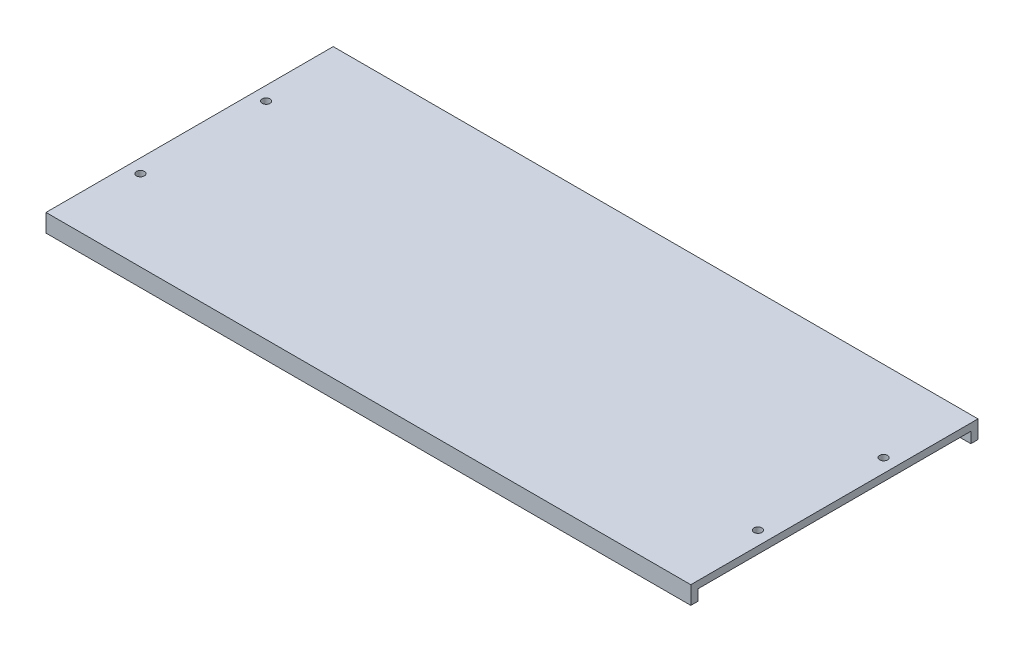
ISO-10303-21;
HEADER;
FILE_DESCRIPTION(('STEP AP214'),'2;1');
FILE_NAME('part.step','',(''),(''),'','','');
FILE_SCHEMA(('AUTOMOTIVE_DESIGN { 1 0 10303 214 1 1 1 1 }'));
ENDSEC;
DATA;
#1=APPLICATION_CONTEXT('core data for automotive mechanical design processes');
#2=APPLICATION_PROTOCOL_DEFINITION('international standard','automotive_design',2000,#1);
#3=PRODUCT_CONTEXT('',#1,'mechanical');
#4=PRODUCT('Part','Part','',(#3));
#5=PRODUCT_RELATED_PRODUCT_CATEGORY('part','',(#4));
#6=PRODUCT_DEFINITION_FORMATION('','',#4);
#7=PRODUCT_DEFINITION_CONTEXT('part definition',#1,'design');
#8=PRODUCT_DEFINITION('design','',#6,#7);
#9=PRODUCT_DEFINITION_SHAPE('','',#8);
#10=(LENGTH_UNIT() NAMED_UNIT(*) SI_UNIT(.MILLI.,.METRE.));
#11=(NAMED_UNIT(*) PLANE_ANGLE_UNIT() SI_UNIT($,.RADIAN.));
#12=(NAMED_UNIT(*) SI_UNIT($,.STERADIAN.) SOLID_ANGLE_UNIT());
#13=UNCERTAINTY_MEASURE_WITH_UNIT(LENGTH_MEASURE(1.E-05),#10,'distance_accuracy_value','');
#14=(GEOMETRIC_REPRESENTATION_CONTEXT(3) GLOBAL_UNCERTAINTY_ASSIGNED_CONTEXT((#13)) GLOBAL_UNIT_ASSIGNED_CONTEXT((#10,
#11,#12)) REPRESENTATION_CONTEXT('',''));
#15=CARTESIAN_POINT('',(0.,0.,0.));
#16=DIRECTION('',(0.,0.,1.));
#17=DIRECTION('',(1.,0.,0.));
#18=AXIS2_PLACEMENT_3D('',#15,#16,#17);
#19=CARTESIAN_POINT('',(0.,2.,0.));
#20=DIRECTION('',(0.,-1.,0.));
#21=DIRECTION('',(0.,0.,-1.));
#22=AXIS2_PLACEMENT_3D('',#19,#20,#21);
#23=PLANE('',#22);
#24=DIRECTION('',(0.,0.,-1.));
#25=VECTOR('',#24,1.);
#26=CARTESIAN_POINT('',(89.8,2.,38.));
#27=LINE('',#26,#25);
#28=CARTESIAN_POINT('',(89.7999999999999,2.,40.));
#29=VERTEX_POINT('',#28);
#30=CARTESIAN_POINT('',(89.8,2.,-40.));
#31=VERTEX_POINT('',#30);
#32=EDGE_CURVE('E44',#29,#31,#27,.T.);
#33=ORIENTED_EDGE('',*,*,#32,.T.);
#34=DIRECTION('',(-1.,0.,0.));
#35=VECTOR('',#34,1.);
#36=CARTESIAN_POINT('',(89.8,2.,-40.));
#37=LINE('',#36,#35);
#38=CARTESIAN_POINT('',(-89.8,2.,-40.));
#39=VERTEX_POINT('',#38);
#40=EDGE_CURVE('E133',#31,#39,#37,.T.);
#41=ORIENTED_EDGE('',*,*,#40,.T.);
#42=DIRECTION('',(0.,0.,1.));
#43=VECTOR('',#42,1.);
#44=CARTESIAN_POINT('',(-89.8,2.,38.));
#45=LINE('',#44,#43);
#46=CARTESIAN_POINT('',(-89.8,2.,40.));
#47=VERTEX_POINT('',#46);
#48=EDGE_CURVE('E11',#39,#47,#45,.T.);
#49=ORIENTED_EDGE('',*,*,#48,.T.);
#50=DIRECTION('',(1.,0.,0.));
#51=VECTOR('',#50,1.);
#52=CARTESIAN_POINT('',(89.7999999999999,2.,40.));
#53=LINE('',#52,#51);
#54=EDGE_CURVE('E126',#47,#29,#53,.T.);
#55=ORIENTED_EDGE('',*,*,#54,.T.);
#56=EDGE_LOOP('',(#33,#41,#49,#55));
#57=FACE_BOUND('',#56,.T.);
#58=CARTESIAN_POINT('',(-86.,2.,-17.5));
#59=DIRECTION('',(0.,1.,0.));
#60=DIRECTION('',(0.,0.,1.));
#61=AXIS2_PLACEMENT_3D('',#58,#59,#60);
#62=CIRCLE('',#61,1.10000000000001);
#63=CARTESIAN_POINT('',(-86.,2.,-16.4));
#64=VERTEX_POINT('',#63);
#65=EDGE_CURVE('E181',#64,#64,#62,.T.);
#66=ORIENTED_EDGE('',*,*,#65,.F.);
#67=EDGE_LOOP('',(#66));
#68=FACE_BOUND('',#67,.T.);
#69=CARTESIAN_POINT('',(-86.,2.,17.5));
#70=DIRECTION('',(0.,1.,0.));
#71=DIRECTION('',(0.,0.,-1.));
#72=AXIS2_PLACEMENT_3D('',#69,#70,#71);
#73=CIRCLE('',#72,1.10000000000001);
#74=CARTESIAN_POINT('',(-86.,2.,16.4));
#75=VERTEX_POINT('',#74);
#76=EDGE_CURVE('E175',#75,#75,#73,.T.);
#77=ORIENTED_EDGE('',*,*,#76,.F.);
#78=EDGE_LOOP('',(#77));
#79=FACE_BOUND('',#78,.T.);
#80=CARTESIAN_POINT('',(86.,2.,17.5));
#81=DIRECTION('',(0.,1.,0.));
#82=DIRECTION('',(0.,0.,1.));
#83=AXIS2_PLACEMENT_3D('',#80,#81,#82);
#84=CIRCLE('',#83,1.10000000000001);
#85=CARTESIAN_POINT('',(86.,2.,18.6));
#86=VERTEX_POINT('',#85);
#87=EDGE_CURVE('E169',#86,#86,#84,.T.);
#88=ORIENTED_EDGE('',*,*,#87,.F.);
#89=EDGE_LOOP('',(#88));
#90=FACE_BOUND('',#89,.T.);
#91=CARTESIAN_POINT('',(86.,2.,-17.5));
#92=DIRECTION('',(0.,1.,0.));
#93=DIRECTION('',(0.,0.,-1.));
#94=AXIS2_PLACEMENT_3D('',#91,#92,#93);
#95=CIRCLE('',#94,1.10000000000001);
#96=CARTESIAN_POINT('',(86.,2.,-18.6));
#97=VERTEX_POINT('',#96);
#98=EDGE_CURVE('E163',#97,#97,#95,.T.);
#99=ORIENTED_EDGE('',*,*,#98,.F.);
#100=EDGE_LOOP('',(#99));
#101=FACE_BOUND('',#100,.T.);
#102=ADVANCED_FACE('F35',(#57,#68,#79,#90,#101),#23,.F.);
#103=CARTESIAN_POINT('',(0.,0.,0.));
#104=DIRECTION('',(0.,-1.,0.));
#105=DIRECTION('',(0.,0.,-1.));
#106=AXIS2_PLACEMENT_3D('',#103,#104,#105);
#107=PLANE('',#106);
#108=CARTESIAN_POINT('',(86.,0.,17.5));
#109=DIRECTION('',(0.,1.,0.));
#110=DIRECTION('',(0.,0.,1.));
#111=AXIS2_PLACEMENT_3D('',#108,#109,#110);
#112=CIRCLE('',#111,1.10000000000001);
#113=CARTESIAN_POINT('',(86.,0.,18.6));
#114=VERTEX_POINT('',#113);
#115=EDGE_CURVE('E166',#114,#114,#112,.T.);
#116=ORIENTED_EDGE('',*,*,#115,.T.);
#117=EDGE_LOOP('',(#116));
#118=FACE_BOUND('',#117,.T.);
#119=CARTESIAN_POINT('',(-86.,0.,-17.5));
#120=DIRECTION('',(0.,1.,0.));
#121=DIRECTION('',(0.,0.,1.));
#122=AXIS2_PLACEMENT_3D('',#119,#120,#121);
#123=CIRCLE('',#122,1.10000000000001);
#124=CARTESIAN_POINT('',(-86.,0.,-16.4));
#125=VERTEX_POINT('',#124);
#126=EDGE_CURVE('E178',#125,#125,#123,.T.);
#127=ORIENTED_EDGE('',*,*,#126,.T.);
#128=EDGE_LOOP('',(#127));
#129=FACE_BOUND('',#128,.T.);
#130=DIRECTION('',(0.,0.,-1.));
#131=VECTOR('',#130,1.);
#132=CARTESIAN_POINT('',(89.8,0.,38.));
#133=LINE('',#132,#131);
#134=CARTESIAN_POINT('',(89.7999999999999,0.,38.));
#135=VERTEX_POINT('',#134);
#136=CARTESIAN_POINT('',(89.8,0.,-38.));
#137=VERTEX_POINT('',#136);
#138=EDGE_CURVE('E184',#135,#137,#133,.T.);
#139=ORIENTED_EDGE('',*,*,#138,.F.);
#140=DIRECTION('',(1.,0.,0.));
#141=VECTOR('',#140,1.);
#142=CARTESIAN_POINT('',(-89.8,0.,38.));
#143=LINE('',#142,#141);
#144=CARTESIAN_POINT('',(-89.8,0.,38.));
#145=VERTEX_POINT('',#144);
#146=EDGE_CURVE('E39',#145,#135,#143,.T.);
#147=ORIENTED_EDGE('',*,*,#146,.F.);
#148=DIRECTION('',(0.,0.,1.));
#149=VECTOR('',#148,1.);
#150=CARTESIAN_POINT('',(-89.8,0.,38.));
#151=LINE('',#150,#149);
#152=CARTESIAN_POINT('',(-89.8,0.,-38.));
#153=VERTEX_POINT('',#152);
#154=EDGE_CURVE('E52',#153,#145,#151,.T.);
#155=ORIENTED_EDGE('',*,*,#154,.F.);
#156=DIRECTION('',(-1.,0.,0.));
#157=VECTOR('',#156,1.);
#158=CARTESIAN_POINT('',(-89.8,0.,-38.));
#159=LINE('',#158,#157);
#160=EDGE_CURVE('E59',#137,#153,#159,.T.);
#161=ORIENTED_EDGE('',*,*,#160,.F.);
#162=EDGE_LOOP('',(#139,#147,#155,#161));
#163=FACE_BOUND('',#162,.T.);
#164=CARTESIAN_POINT('',(-86.,0.,17.5));
#165=DIRECTION('',(0.,1.,0.));
#166=DIRECTION('',(0.,0.,-1.));
#167=AXIS2_PLACEMENT_3D('',#164,#165,#166);
#168=CIRCLE('',#167,1.10000000000001);
#169=CARTESIAN_POINT('',(-86.,0.,16.4));
#170=VERTEX_POINT('',#169);
#171=EDGE_CURVE('E172',#170,#170,#168,.T.);
#172=ORIENTED_EDGE('',*,*,#171,.T.);
#173=EDGE_LOOP('',(#172));
#174=FACE_BOUND('',#173,.T.);
#175=CARTESIAN_POINT('',(86.,0.,-17.5));
#176=DIRECTION('',(0.,1.,0.));
#177=DIRECTION('',(0.,0.,-1.));
#178=AXIS2_PLACEMENT_3D('',#175,#176,#177);
#179=CIRCLE('',#178,1.10000000000001);
#180=CARTESIAN_POINT('',(86.,0.,-18.6));
#181=VERTEX_POINT('',#180);
#182=EDGE_CURVE('E156',#181,#181,#179,.T.);
#183=ORIENTED_EDGE('',*,*,#182,.T.);
#184=EDGE_LOOP('',(#183));
#185=FACE_BOUND('',#184,.T.);
#186=ADVANCED_FACE('F207',(#118,#129,#163,#174,#185),#107,.T.);
#187=CARTESIAN_POINT('',(89.8,2.,38.));
#188=DIRECTION('',(-1.,0.,0.));
#189=DIRECTION('',(0.,0.,1.));
#190=AXIS2_PLACEMENT_3D('',#187,#188,#189);
#191=PLANE('',#190);
#192=ORIENTED_EDGE('',*,*,#138,.T.);
#193=DIRECTION('',(0.,1.,0.));
#194=VECTOR('',#193,1.);
#195=CARTESIAN_POINT('',(89.8,-3.,-38.));
#196=LINE('',#195,#194);
#197=CARTESIAN_POINT('',(89.8,-3.,-38.));
#198=VERTEX_POINT('',#197);
#199=EDGE_CURVE('E159',#198,#137,#196,.T.);
#200=ORIENTED_EDGE('',*,*,#199,.F.);
#201=DIRECTION('',(0.,0.,-1.));
#202=VECTOR('',#201,1.);
#203=CARTESIAN_POINT('',(89.8,-3.,-38.));
#204=LINE('',#203,#202);
#205=CARTESIAN_POINT('',(89.8,-3.,-40.));
#206=VERTEX_POINT('',#205);
#207=EDGE_CURVE('E144',#198,#206,#204,.T.);
#208=ORIENTED_EDGE('',*,*,#207,.T.);
#209=DIRECTION('',(0.,1.,0.));
#210=VECTOR('',#209,1.);
#211=CARTESIAN_POINT('',(89.8,-3.,-40.));
#212=LINE('',#211,#210);
#213=EDGE_CURVE('E157',#206,#31,#212,.T.);
#214=ORIENTED_EDGE('',*,*,#213,.T.);
#215=ORIENTED_EDGE('',*,*,#32,.F.);
#216=DIRECTION('',(0.,1.,0.));
#217=VECTOR('',#216,1.);
#218=CARTESIAN_POINT('',(89.7999999999999,-3.,40.));
#219=LINE('',#218,#217);
#220=CARTESIAN_POINT('',(89.7999999999999,-3.,40.));
#221=VERTEX_POINT('',#220);
#222=EDGE_CURVE('E101',#221,#29,#219,.T.);
#223=ORIENTED_EDGE('',*,*,#222,.F.);
#224=DIRECTION('',(0.,0.,-1.));
#225=VECTOR('',#224,1.);
#226=CARTESIAN_POINT('',(89.7999999999999,-3.,38.));
#227=LINE('',#226,#225);
#228=CARTESIAN_POINT('',(89.7999999999999,-3.,38.));
#229=VERTEX_POINT('',#228);
#230=EDGE_CURVE('E104',#221,#229,#227,.T.);
#231=ORIENTED_EDGE('',*,*,#230,.T.);
#232=DIRECTION('',(0.,1.,0.));
#233=VECTOR('',#232,1.);
#234=CARTESIAN_POINT('',(89.7999999999999,-3.,38.));
#235=LINE('',#234,#233);
#236=EDGE_CURVE('E110',#229,#135,#235,.T.);
#237=ORIENTED_EDGE('',*,*,#236,.T.);
#238=EDGE_LOOP('',(#192,#200,#208,#214,#215,#223,#231,#237));
#239=FACE_BOUND('',#238,.T.);
#240=ADVANCED_FACE('F37',(#239),#191,.F.);
#241=CARTESIAN_POINT('',(-89.8,2.,38.));
#242=DIRECTION('',(1.,0.,0.));
#243=DIRECTION('',(0.,0.,-1.));
#244=AXIS2_PLACEMENT_3D('',#241,#242,#243);
#245=PLANE('',#244);
#246=ORIENTED_EDGE('',*,*,#154,.T.);
#247=DIRECTION('',(0.,1.,0.));
#248=VECTOR('',#247,1.);
#249=CARTESIAN_POINT('',(-89.8,-3.,38.));
#250=LINE('',#249,#248);
#251=CARTESIAN_POINT('',(-89.8,-3.,38.));
#252=VERTEX_POINT('',#251);
#253=EDGE_CURVE('E134',#252,#145,#250,.T.);
#254=ORIENTED_EDGE('',*,*,#253,.F.);
#255=DIRECTION('',(0.,0.,1.));
#256=VECTOR('',#255,1.);
#257=CARTESIAN_POINT('',(-89.8,-3.,40.));
#258=LINE('',#257,#256);
#259=CARTESIAN_POINT('',(-89.8,-3.,40.));
#260=VERTEX_POINT('',#259);
#261=EDGE_CURVE('E111',#252,#260,#258,.T.);
#262=ORIENTED_EDGE('',*,*,#261,.T.);
#263=DIRECTION('',(0.,1.,0.));
#264=VECTOR('',#263,1.);
#265=CARTESIAN_POINT('',(-89.8,-3.,40.));
#266=LINE('',#265,#264);
#267=EDGE_CURVE('E125',#260,#47,#266,.T.);
#268=ORIENTED_EDGE('',*,*,#267,.T.);
#269=ORIENTED_EDGE('',*,*,#48,.F.);
#270=DIRECTION('',(0.,1.,0.));
#271=VECTOR('',#270,1.);
#272=CARTESIAN_POINT('',(-89.8,-3.,-40.));
#273=LINE('',#272,#271);
#274=CARTESIAN_POINT('',(-89.8,-3.,-40.));
#275=VERTEX_POINT('',#274);
#276=EDGE_CURVE('E153',#275,#39,#273,.T.);
#277=ORIENTED_EDGE('',*,*,#276,.F.);
#278=DIRECTION('',(0.,0.,1.));
#279=VECTOR('',#278,1.);
#280=CARTESIAN_POINT('',(-89.8,-3.,-40.));
#281=LINE('',#280,#279);
#282=CARTESIAN_POINT('',(-89.8,-3.,-38.));
#283=VERTEX_POINT('',#282);
#284=EDGE_CURVE('E138',#275,#283,#281,.T.);
#285=ORIENTED_EDGE('',*,*,#284,.T.);
#286=DIRECTION('',(0.,1.,0.));
#287=VECTOR('',#286,1.);
#288=CARTESIAN_POINT('',(-89.8,-3.,-38.));
#289=LINE('',#288,#287);
#290=EDGE_CURVE('E150',#283,#153,#289,.T.);
#291=ORIENTED_EDGE('',*,*,#290,.T.);
#292=EDGE_LOOP('',(#246,#254,#262,#268,#269,#277,#285,#291));
#293=FACE_BOUND('',#292,.T.);
#294=ADVANCED_FACE('F200',(#293),#245,.F.);
#295=CARTESIAN_POINT('',(-86.,2.,-17.5));
#296=DIRECTION('',(0.,-1.,0.));
#297=DIRECTION('',(0.,0.,-1.));
#298=AXIS2_PLACEMENT_3D('',#295,#296,#297);
#299=CYLINDRICAL_SURFACE('',#298,1.10000000000001);
#300=ORIENTED_EDGE('',*,*,#65,.T.);
#301=EDGE_LOOP('',(#300));
#302=FACE_BOUND('',#301,.T.);
#303=ORIENTED_EDGE('',*,*,#126,.F.);
#304=EDGE_LOOP('',(#303));
#305=FACE_BOUND('',#304,.T.);
#306=ADVANCED_FACE('F233',(#302,#305),#299,.F.);
#307=CARTESIAN_POINT('',(-86.,2.,17.5));
#308=DIRECTION('',(0.,-1.,0.));
#309=DIRECTION('',(0.,0.,-1.));
#310=AXIS2_PLACEMENT_3D('',#307,#308,#309);
#311=CYLINDRICAL_SURFACE('',#310,1.10000000000001);
#312=ORIENTED_EDGE('',*,*,#76,.T.);
#313=EDGE_LOOP('',(#312));
#314=FACE_BOUND('',#313,.T.);
#315=ORIENTED_EDGE('',*,*,#171,.F.);
#316=EDGE_LOOP('',(#315));
#317=FACE_BOUND('',#316,.T.);
#318=ADVANCED_FACE('F237',(#314,#317),#311,.F.);
#319=CARTESIAN_POINT('',(86.,2.,17.5));
#320=DIRECTION('',(0.,-1.,0.));
#321=DIRECTION('',(0.,0.,-1.));
#322=AXIS2_PLACEMENT_3D('',#319,#320,#321);
#323=CYLINDRICAL_SURFACE('',#322,1.10000000000001);
#324=ORIENTED_EDGE('',*,*,#87,.T.);
#325=EDGE_LOOP('',(#324));
#326=FACE_BOUND('',#325,.T.);
#327=ORIENTED_EDGE('',*,*,#115,.F.);
#328=EDGE_LOOP('',(#327));
#329=FACE_BOUND('',#328,.T.);
#330=ADVANCED_FACE('F220',(#326,#329),#323,.F.);
#331=CARTESIAN_POINT('',(86.,2.,-17.5));
#332=DIRECTION('',(0.,-1.,0.));
#333=DIRECTION('',(0.,0.,-1.));
#334=AXIS2_PLACEMENT_3D('',#331,#332,#333);
#335=CYLINDRICAL_SURFACE('',#334,1.10000000000001);
#336=ORIENTED_EDGE('',*,*,#98,.T.);
#337=EDGE_LOOP('',(#336));
#338=FACE_BOUND('',#337,.T.);
#339=ORIENTED_EDGE('',*,*,#182,.F.);
#340=EDGE_LOOP('',(#339));
#341=FACE_BOUND('',#340,.T.);
#342=ADVANCED_FACE('F217',(#338,#341),#335,.F.);
#343=CARTESIAN_POINT('',(89.8,-3.,-40.));
#344=DIRECTION('',(0.,0.,-1.));
#345=DIRECTION('',(-1.,0.,0.));
#346=AXIS2_PLACEMENT_3D('',#343,#344,#345);
#347=PLANE('',#346);
#348=ORIENTED_EDGE('',*,*,#40,.F.);
#349=ORIENTED_EDGE('',*,*,#213,.F.);
#350=DIRECTION('',(-1.,0.,0.));
#351=VECTOR('',#350,1.);
#352=CARTESIAN_POINT('',(89.8,-3.,-40.));
#353=LINE('',#352,#351);
#354=EDGE_CURVE('E147',#206,#275,#353,.T.);
#355=ORIENTED_EDGE('',*,*,#354,.T.);
#356=ORIENTED_EDGE('',*,*,#276,.T.);
#357=EDGE_LOOP('',(#348,#349,#355,#356));
#358=FACE_BOUND('',#357,.T.);
#359=ADVANCED_FACE('F203',(#358),#347,.T.);
#360=CARTESIAN_POINT('',(-89.8,-3.,-38.));
#361=DIRECTION('',(0.,0.,1.));
#362=DIRECTION('',(1.,0.,0.));
#363=AXIS2_PLACEMENT_3D('',#360,#361,#362);
#364=PLANE('',#363);
#365=ORIENTED_EDGE('',*,*,#199,.T.);
#366=ORIENTED_EDGE('',*,*,#160,.T.);
#367=ORIENTED_EDGE('',*,*,#290,.F.);
#368=DIRECTION('',(1.,0.,0.));
#369=VECTOR('',#368,1.);
#370=CARTESIAN_POINT('',(-89.8,-3.,-38.));
#371=LINE('',#370,#369);
#372=EDGE_CURVE('E141',#283,#198,#371,.T.);
#373=ORIENTED_EDGE('',*,*,#372,.T.);
#374=EDGE_LOOP('',(#365,#366,#367,#373));
#375=FACE_BOUND('',#374,.T.);
#376=ADVANCED_FACE('F194',(#375),#364,.T.);
#377=CARTESIAN_POINT('',(0.,-3.,0.));
#378=DIRECTION('',(0.,1.,0.));
#379=DIRECTION('',(0.,0.,1.));
#380=AXIS2_PLACEMENT_3D('',#377,#378,#379);
#381=PLANE('',#380);
#382=ORIENTED_EDGE('',*,*,#284,.F.);
#383=ORIENTED_EDGE('',*,*,#354,.F.);
#384=ORIENTED_EDGE('',*,*,#207,.F.);
#385=ORIENTED_EDGE('',*,*,#372,.F.);
#386=EDGE_LOOP('',(#382,#383,#384,#385));
#387=FACE_BOUND('',#386,.T.);
#388=ADVANCED_FACE('F198',(#387),#381,.F.);
#389=CARTESIAN_POINT('',(89.7999999999999,-3.,40.));
#390=DIRECTION('',(0.,0.,1.));
#391=DIRECTION('',(1.,0.,0.));
#392=AXIS2_PLACEMENT_3D('',#389,#390,#391);
#393=PLANE('',#392);
#394=ORIENTED_EDGE('',*,*,#54,.F.);
#395=ORIENTED_EDGE('',*,*,#267,.F.);
#396=DIRECTION('',(1.,0.,0.));
#397=VECTOR('',#396,1.);
#398=CARTESIAN_POINT('',(89.7999999999999,-3.,40.));
#399=LINE('',#398,#397);
#400=EDGE_CURVE('E118',#260,#221,#399,.T.);
#401=ORIENTED_EDGE('',*,*,#400,.T.);
#402=ORIENTED_EDGE('',*,*,#222,.T.);
#403=EDGE_LOOP('',(#394,#395,#401,#402));
#404=FACE_BOUND('',#403,.T.);
#405=ADVANCED_FACE('F123',(#404),#393,.T.);
#406=CARTESIAN_POINT('',(-89.8,-3.,38.));
#407=DIRECTION('',(0.,0.,-1.));
#408=DIRECTION('',(-1.,0.,0.));
#409=AXIS2_PLACEMENT_3D('',#406,#407,#408);
#410=PLANE('',#409);
#411=ORIENTED_EDGE('',*,*,#253,.T.);
#412=ORIENTED_EDGE('',*,*,#146,.T.);
#413=ORIENTED_EDGE('',*,*,#236,.F.);
#414=DIRECTION('',(-1.,0.,0.));
#415=VECTOR('',#414,1.);
#416=CARTESIAN_POINT('',(-89.8,-3.,38.));
#417=LINE('',#416,#415);
#418=EDGE_CURVE('E121',#229,#252,#417,.T.);
#419=ORIENTED_EDGE('',*,*,#418,.T.);
#420=EDGE_LOOP('',(#411,#412,#413,#419));
#421=FACE_BOUND('',#420,.T.);
#422=ADVANCED_FACE('F191',(#421),#410,.T.);
#423=CARTESIAN_POINT('',(0.,-3.,0.));
#424=DIRECTION('',(0.,-1.,0.));
#425=DIRECTION('',(0.,0.,-1.));
#426=AXIS2_PLACEMENT_3D('',#423,#424,#425);
#427=PLANE('',#426);
#428=ORIENTED_EDGE('',*,*,#400,.F.);
#429=ORIENTED_EDGE('',*,*,#261,.F.);
#430=ORIENTED_EDGE('',*,*,#418,.F.);
#431=ORIENTED_EDGE('',*,*,#230,.F.);
#432=EDGE_LOOP('',(#428,#429,#430,#431));
#433=FACE_BOUND('',#432,.T.);
#434=ADVANCED_FACE('F116',(#433),#427,.T.);
#435=CLOSED_SHELL('',(#102,#186,#240,#294,#306,#318,#330,#342,#359,#376,#388,#405,#422,#434));
#436=MANIFOLD_SOLID_BREP('B2',#435);
#437=ADVANCED_BREP_SHAPE_REPRESENTATION('',(#18,#436),#14);
#438=SHAPE_DEFINITION_REPRESENTATION(#9,#437);
ENDSEC;
END-ISO-10303-21;
